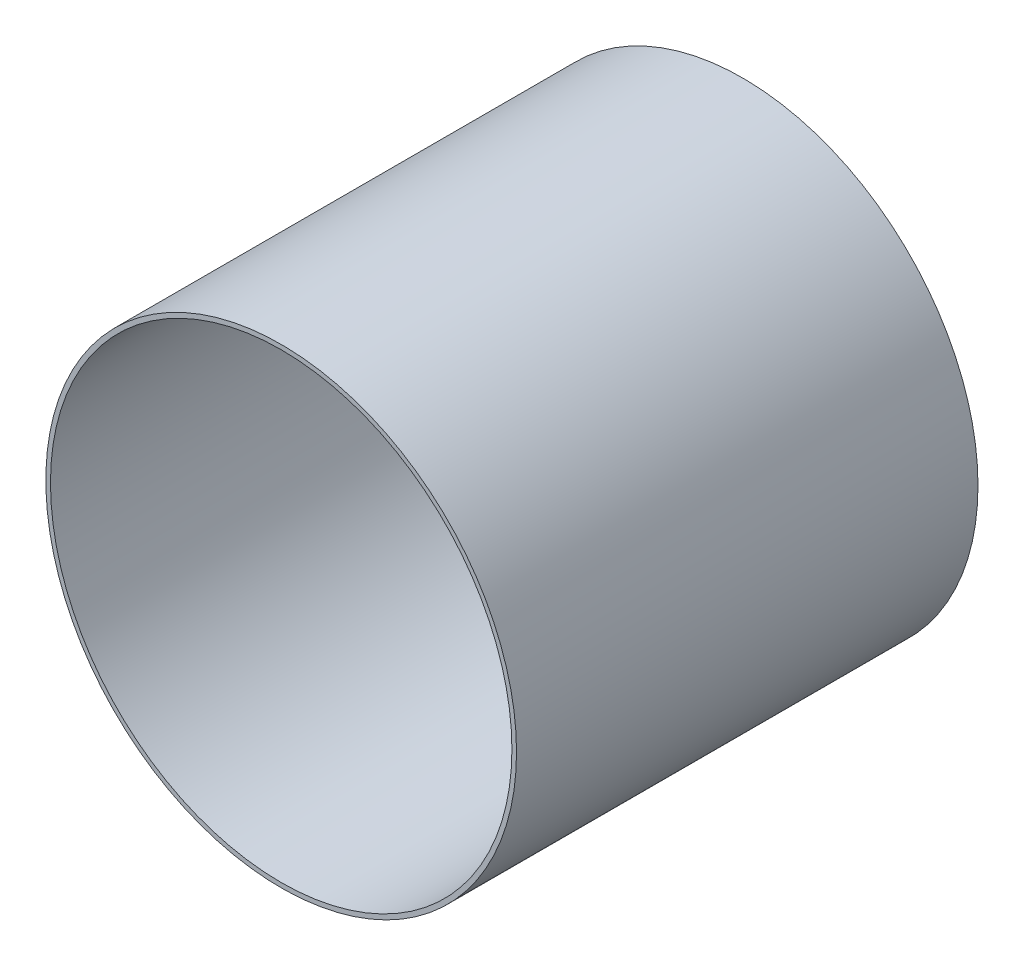
ISO-10303-21;
HEADER;
FILE_DESCRIPTION(('STEP AP214'),'2;1');
FILE_NAME('part.step','',(''),(''),'','','');
FILE_SCHEMA(('AUTOMOTIVE_DESIGN { 1 0 10303 214 1 1 1 1 }'));
ENDSEC;
DATA;
#1=APPLICATION_CONTEXT('core data for automotive mechanical design processes');
#2=APPLICATION_PROTOCOL_DEFINITION('international standard','automotive_design',2000,#1);
#3=PRODUCT_CONTEXT('',#1,'mechanical');
#4=PRODUCT('Part','Part','',(#3));
#5=PRODUCT_RELATED_PRODUCT_CATEGORY('part','',(#4));
#6=PRODUCT_DEFINITION_FORMATION('','',#4);
#7=PRODUCT_DEFINITION_CONTEXT('part definition',#1,'design');
#8=PRODUCT_DEFINITION('design','',#6,#7);
#9=PRODUCT_DEFINITION_SHAPE('','',#8);
#10=(LENGTH_UNIT() NAMED_UNIT(*) SI_UNIT(.MILLI.,.METRE.));
#11=(NAMED_UNIT(*) PLANE_ANGLE_UNIT() SI_UNIT($,.RADIAN.));
#12=(NAMED_UNIT(*) SI_UNIT($,.STERADIAN.) SOLID_ANGLE_UNIT());
#13=UNCERTAINTY_MEASURE_WITH_UNIT(LENGTH_MEASURE(1.E-05),#10,'distance_accuracy_value','');
#14=(GEOMETRIC_REPRESENTATION_CONTEXT(3) GLOBAL_UNCERTAINTY_ASSIGNED_CONTEXT((#13)) GLOBAL_UNIT_ASSIGNED_CONTEXT((#10,
#11,#12)) REPRESENTATION_CONTEXT('',''));
#15=CARTESIAN_POINT('',(0.,0.,0.));
#16=DIRECTION('',(0.,0.,1.));
#17=DIRECTION('',(1.,0.,0.));
#18=AXIS2_PLACEMENT_3D('',#15,#16,#17);
#19=CARTESIAN_POINT('',(0.,0.,200.));
#20=DIRECTION('',(0.,0.,1.));
#21=DIRECTION('',(1.,0.,0.));
#22=AXIS2_PLACEMENT_3D('',#19,#20,#21);
#23=PLANE('',#22);
#24=CARTESIAN_POINT('',(0.,0.,200.));
#25=DIRECTION('',(0.,0.,1.));
#26=DIRECTION('',(1.,0.,0.));
#27=AXIS2_PLACEMENT_3D('',#24,#25,#26);
#28=CIRCLE('',#27,102.);
#29=CARTESIAN_POINT('',(102.,0.,200.));
#30=VERTEX_POINT('',#29);
#31=EDGE_CURVE('E11',#30,#30,#28,.T.);
#32=ORIENTED_EDGE('',*,*,#31,.T.);
#33=EDGE_LOOP('',(#32));
#34=FACE_BOUND('',#33,.T.);
#35=CARTESIAN_POINT('',(0.,0.,200.));
#36=DIRECTION('',(0.,0.,1.));
#37=DIRECTION('',(1.,0.,0.));
#38=AXIS2_PLACEMENT_3D('',#35,#36,#37);
#39=CIRCLE('',#38,100.);
#40=CARTESIAN_POINT('',(100.,0.,200.));
#41=VERTEX_POINT('',#40);
#42=EDGE_CURVE('E50',#41,#41,#39,.T.);
#43=ORIENTED_EDGE('',*,*,#42,.F.);
#44=EDGE_LOOP('',(#43));
#45=FACE_BOUND('',#44,.T.);
#46=ADVANCED_FACE('F39',(#34,#45),#23,.T.);
#47=CARTESIAN_POINT('',(0.,0.,0.));
#48=DIRECTION('',(0.,0.,1.));
#49=DIRECTION('',(1.,0.,0.));
#50=AXIS2_PLACEMENT_3D('',#47,#48,#49);
#51=PLANE('',#50);
#52=CARTESIAN_POINT('',(0.,0.,0.));
#53=DIRECTION('',(0.,0.,1.));
#54=DIRECTION('',(1.,0.,0.));
#55=AXIS2_PLACEMENT_3D('',#52,#53,#54);
#56=CIRCLE('',#55,102.);
#57=CARTESIAN_POINT('',(102.,0.,0.));
#58=VERTEX_POINT('',#57);
#59=EDGE_CURVE('E43',#58,#58,#56,.T.);
#60=ORIENTED_EDGE('',*,*,#59,.F.);
#61=EDGE_LOOP('',(#60));
#62=FACE_BOUND('',#61,.T.);
#63=CARTESIAN_POINT('',(0.,0.,0.));
#64=DIRECTION('',(0.,0.,1.));
#65=DIRECTION('',(1.,0.,0.));
#66=AXIS2_PLACEMENT_3D('',#63,#64,#65);
#67=CIRCLE('',#66,100.);
#68=CARTESIAN_POINT('',(100.,0.,0.));
#69=VERTEX_POINT('',#68);
#70=EDGE_CURVE('E52',#69,#69,#67,.T.);
#71=ORIENTED_EDGE('',*,*,#70,.T.);
#72=EDGE_LOOP('',(#71));
#73=FACE_BOUND('',#72,.T.);
#74=ADVANCED_FACE('F62',(#62,#73),#51,.F.);
#75=CARTESIAN_POINT('',(0.,0.,200.));
#76=DIRECTION('',(0.,0.,-1.));
#77=DIRECTION('',(-1.,0.,0.));
#78=AXIS2_PLACEMENT_3D('',#75,#76,#77);
#79=CYLINDRICAL_SURFACE('',#78,102.);
#80=ORIENTED_EDGE('',*,*,#31,.F.);
#81=EDGE_LOOP('',(#80));
#82=FACE_BOUND('',#81,.T.);
#83=ORIENTED_EDGE('',*,*,#59,.T.);
#84=EDGE_LOOP('',(#83));
#85=FACE_BOUND('',#84,.T.);
#86=ADVANCED_FACE('F41',(#82,#85),#79,.T.);
#87=CARTESIAN_POINT('',(0.,0.,200.));
#88=DIRECTION('',(0.,0.,-1.));
#89=DIRECTION('',(-1.,0.,0.));
#90=AXIS2_PLACEMENT_3D('',#87,#88,#89);
#91=CYLINDRICAL_SURFACE('',#90,100.);
#92=ORIENTED_EDGE('',*,*,#42,.T.);
#93=EDGE_LOOP('',(#92));
#94=FACE_BOUND('',#93,.T.);
#95=ORIENTED_EDGE('',*,*,#70,.F.);
#96=EDGE_LOOP('',(#95));
#97=FACE_BOUND('',#96,.T.);
#98=ADVANCED_FACE('F58',(#94,#97),#91,.F.);
#99=CLOSED_SHELL('',(#46,#74,#86,#98));
#100=MANIFOLD_SOLID_BREP('B2',#99);
#101=ADVANCED_BREP_SHAPE_REPRESENTATION('',(#18,#100),#14);
#102=SHAPE_DEFINITION_REPRESENTATION(#9,#101);
ENDSEC;
END-ISO-10303-21;
